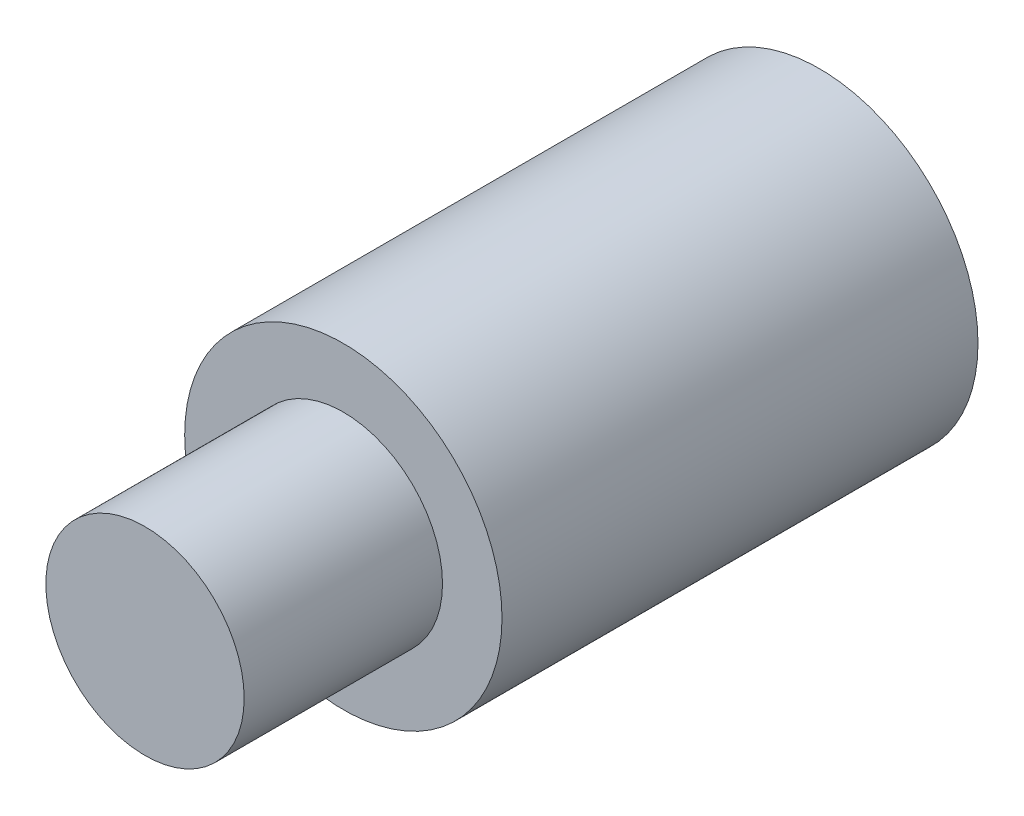
ISO-10303-21;
HEADER;
FILE_DESCRIPTION(('STEP AP214'),'2;1');
FILE_NAME('part.step','',(''),(''),'','','');
FILE_SCHEMA(('AUTOMOTIVE_DESIGN { 1 0 10303 214 1 1 1 1 }'));
ENDSEC;
DATA;
#1=APPLICATION_CONTEXT('core data for automotive mechanical design processes');
#2=APPLICATION_PROTOCOL_DEFINITION('international standard','automotive_design',2000,#1);
#3=PRODUCT_CONTEXT('',#1,'mechanical');
#4=PRODUCT('Part','Part','',(#3));
#5=PRODUCT_RELATED_PRODUCT_CATEGORY('part','',(#4));
#6=PRODUCT_DEFINITION_FORMATION('','',#4);
#7=PRODUCT_DEFINITION_CONTEXT('part definition',#1,'design');
#8=PRODUCT_DEFINITION('design','',#6,#7);
#9=PRODUCT_DEFINITION_SHAPE('','',#8);
#10=(LENGTH_UNIT() NAMED_UNIT(*) SI_UNIT(.MILLI.,.METRE.));
#11=(NAMED_UNIT(*) PLANE_ANGLE_UNIT() SI_UNIT($,.RADIAN.));
#12=(NAMED_UNIT(*) SI_UNIT($,.STERADIAN.) SOLID_ANGLE_UNIT());
#13=UNCERTAINTY_MEASURE_WITH_UNIT(LENGTH_MEASURE(1.E-05),#10,'distance_accuracy_value','');
#14=(GEOMETRIC_REPRESENTATION_CONTEXT(3) GLOBAL_UNCERTAINTY_ASSIGNED_CONTEXT((#13)) GLOBAL_UNIT_ASSIGNED_CONTEXT((#10,
#11,#12)) REPRESENTATION_CONTEXT('',''));
#15=CARTESIAN_POINT('',(0.,0.,0.));
#16=DIRECTION('',(0.,0.,1.));
#17=DIRECTION('',(1.,0.,0.));
#18=AXIS2_PLACEMENT_3D('',#15,#16,#17);
#19=CARTESIAN_POINT('',(0.,0.,5.));
#20=DIRECTION('',(0.,0.,-1.));
#21=DIRECTION('',(-1.,0.,0.));
#22=AXIS2_PLACEMENT_3D('',#19,#20,#21);
#23=CYLINDRICAL_SURFACE('',#22,2.5);
#24=CARTESIAN_POINT('',(0.,0.,5.));
#25=DIRECTION('',(0.,0.,1.));
#26=DIRECTION('',(1.,0.,0.));
#27=AXIS2_PLACEMENT_3D('',#24,#25,#26);
#28=CIRCLE('',#27,2.5);
#29=CARTESIAN_POINT('',(2.5,0.,5.));
#30=VERTEX_POINT('',#29);
#31=EDGE_CURVE('E10',#30,#30,#28,.T.);
#32=ORIENTED_EDGE('',*,*,#31,.F.);
#33=EDGE_LOOP('',(#32));
#34=FACE_BOUND('',#33,.T.);
#35=CARTESIAN_POINT('',(0.,0.,0.));
#36=DIRECTION('',(0.,0.,1.));
#37=DIRECTION('',(1.,0.,0.));
#38=AXIS2_PLACEMENT_3D('',#35,#36,#37);
#39=CIRCLE('',#38,2.5);
#40=CARTESIAN_POINT('',(2.5,0.,0.));
#41=VERTEX_POINT('',#40);
#42=EDGE_CURVE('E45',#41,#41,#39,.T.);
#43=ORIENTED_EDGE('',*,*,#42,.T.);
#44=EDGE_LOOP('',(#43));
#45=FACE_BOUND('',#44,.T.);
#46=ADVANCED_FACE('F39',(#34,#45),#23,.T.);
#47=CARTESIAN_POINT('',(0.,0.,5.));
#48=DIRECTION('',(0.,0.,1.));
#49=DIRECTION('',(1.,0.,0.));
#50=AXIS2_PLACEMENT_3D('',#47,#48,#49);
#51=PLANE('',#50);
#52=ORIENTED_EDGE('',*,*,#31,.T.);
#53=EDGE_LOOP('',(#52));
#54=FACE_BOUND('',#53,.T.);
#55=ADVANCED_FACE('F73',(#54),#51,.T.);
#56=CARTESIAN_POINT('',(0.,0.,0.));
#57=DIRECTION('',(0.,0.,1.));
#58=DIRECTION('',(1.,0.,0.));
#59=AXIS2_PLACEMENT_3D('',#56,#57,#58);
#60=PLANE('',#59);
#61=CARTESIAN_POINT('',(0.,0.,0.));
#62=DIRECTION('',(0.,0.,1.));
#63=DIRECTION('',(1.,0.,0.));
#64=AXIS2_PLACEMENT_3D('',#61,#62,#63);
#65=CIRCLE('',#64,4.);
#66=CARTESIAN_POINT('',(4.,0.,0.));
#67=VERTEX_POINT('',#66);
#68=EDGE_CURVE('E53',#67,#67,#65,.T.);
#69=ORIENTED_EDGE('',*,*,#68,.T.);
#70=EDGE_LOOP('',(#69));
#71=FACE_BOUND('',#70,.T.);
#72=ORIENTED_EDGE('',*,*,#42,.F.);
#73=EDGE_LOOP('',(#72));
#74=FACE_BOUND('',#73,.T.);
#75=ADVANCED_FACE('F59',(#71,#74),#60,.T.);
#76=CARTESIAN_POINT('',(0.,0.,-12.));
#77=DIRECTION('',(0.,0.,1.));
#78=DIRECTION('',(1.,0.,0.));
#79=AXIS2_PLACEMENT_3D('',#76,#77,#78);
#80=CYLINDRICAL_SURFACE('',#79,4.);
#81=CARTESIAN_POINT('',(0.,0.,-12.));
#82=DIRECTION('',(0.,0.,1.));
#83=DIRECTION('',(1.,0.,0.));
#84=AXIS2_PLACEMENT_3D('',#81,#82,#83);
#85=CIRCLE('',#84,4.);
#86=CARTESIAN_POINT('',(4.,0.,-12.));
#87=VERTEX_POINT('',#86);
#88=EDGE_CURVE('E49',#87,#87,#85,.T.);
#89=ORIENTED_EDGE('',*,*,#88,.T.);
#90=EDGE_LOOP('',(#89));
#91=FACE_BOUND('',#90,.T.);
#92=ORIENTED_EDGE('',*,*,#68,.F.);
#93=EDGE_LOOP('',(#92));
#94=FACE_BOUND('',#93,.T.);
#95=ADVANCED_FACE('F62',(#91,#94),#80,.T.);
#96=CARTESIAN_POINT('',(0.,0.,-12.));
#97=DIRECTION('',(0.,0.,1.));
#98=DIRECTION('',(1.,0.,0.));
#99=AXIS2_PLACEMENT_3D('',#96,#97,#98);
#100=PLANE('',#99);
#101=ORIENTED_EDGE('',*,*,#88,.F.);
#102=EDGE_LOOP('',(#101));
#103=FACE_BOUND('',#102,.T.);
#104=ADVANCED_FACE('F64',(#103),#100,.F.);
#105=CLOSED_SHELL('',(#46,#55,#75,#95,#104));
#106=MANIFOLD_SOLID_BREP('B2',#105);
#107=ADVANCED_BREP_SHAPE_REPRESENTATION('',(#18,#106),#14);
#108=SHAPE_DEFINITION_REPRESENTATION(#9,#107);
ENDSEC;
END-ISO-10303-21;
